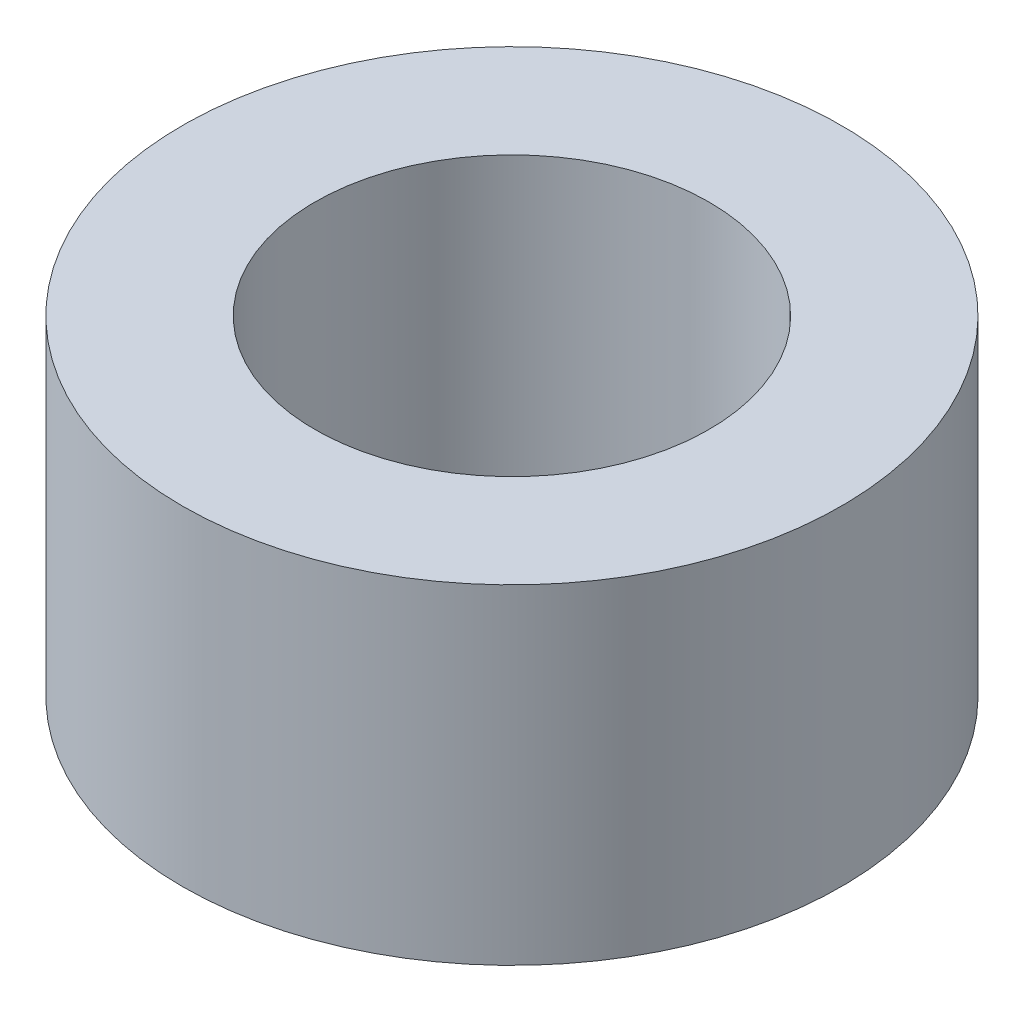
ISO-10303-21;
HEADER;
FILE_DESCRIPTION(('STEP AP214'),'2;1');
FILE_NAME('part.step','',(''),(''),'','','');
FILE_SCHEMA(('AUTOMOTIVE_DESIGN { 1 0 10303 214 1 1 1 1 }'));
ENDSEC;
DATA;
#1=APPLICATION_CONTEXT('core data for automotive mechanical design processes');
#2=APPLICATION_PROTOCOL_DEFINITION('international standard','automotive_design',2000,#1);
#3=PRODUCT_CONTEXT('',#1,'mechanical');
#4=PRODUCT('Part','Part','',(#3));
#5=PRODUCT_RELATED_PRODUCT_CATEGORY('part','',(#4));
#6=PRODUCT_DEFINITION_FORMATION('','',#4);
#7=PRODUCT_DEFINITION_CONTEXT('part definition',#1,'design');
#8=PRODUCT_DEFINITION('design','',#6,#7);
#9=PRODUCT_DEFINITION_SHAPE('','',#8);
#10=(LENGTH_UNIT() NAMED_UNIT(*) SI_UNIT(.MILLI.,.METRE.));
#11=(NAMED_UNIT(*) PLANE_ANGLE_UNIT() SI_UNIT($,.RADIAN.));
#12=(NAMED_UNIT(*) SI_UNIT($,.STERADIAN.) SOLID_ANGLE_UNIT());
#13=UNCERTAINTY_MEASURE_WITH_UNIT(LENGTH_MEASURE(1.E-05),#10,'distance_accuracy_value','');
#14=(GEOMETRIC_REPRESENTATION_CONTEXT(3) GLOBAL_UNCERTAINTY_ASSIGNED_CONTEXT((#13)) GLOBAL_UNIT_ASSIGNED_CONTEXT((#10,
#11,#12)) REPRESENTATION_CONTEXT('',''));
#15=CARTESIAN_POINT('',(0.,0.,0.));
#16=DIRECTION('',(0.,0.,1.));
#17=DIRECTION('',(1.,0.,0.));
#18=AXIS2_PLACEMENT_3D('',#15,#16,#17);
#19=CARTESIAN_POINT('',(0.,3.175,0.));
#20=DIRECTION('',(0.,-1.,0.));
#21=DIRECTION('',(0.,0.,-1.));
#22=AXIS2_PLACEMENT_3D('',#19,#20,#21);
#23=CYLINDRICAL_SURFACE('',#22,3.175);
#24=CARTESIAN_POINT('',(0.,3.175,0.));
#25=DIRECTION('',(0.,1.,0.));
#26=DIRECTION('',(0.,0.,1.));
#27=AXIS2_PLACEMENT_3D('',#24,#25,#26);
#28=CIRCLE('',#27,3.175);
#29=CARTESIAN_POINT('',(0.,3.175,3.175));
#30=VERTEX_POINT('',#29);
#31=EDGE_CURVE('E10',#30,#30,#28,.T.);
#32=ORIENTED_EDGE('',*,*,#31,.F.);
#33=EDGE_LOOP('',(#32));
#34=FACE_BOUND('',#33,.T.);
#35=CARTESIAN_POINT('',(0.,0.,0.));
#36=DIRECTION('',(0.,1.,0.));
#37=DIRECTION('',(0.,0.,1.));
#38=AXIS2_PLACEMENT_3D('',#35,#36,#37);
#39=CIRCLE('',#38,3.175);
#40=CARTESIAN_POINT('',(0.,0.,3.175));
#41=VERTEX_POINT('',#40);
#42=EDGE_CURVE('E34',#41,#41,#39,.T.);
#43=ORIENTED_EDGE('',*,*,#42,.T.);
#44=EDGE_LOOP('',(#43));
#45=FACE_BOUND('',#44,.T.);
#46=ADVANCED_FACE('F31',(#34,#45),#23,.T.);
#47=CARTESIAN_POINT('',(0.,3.175,0.));
#48=DIRECTION('',(0.,1.,0.));
#49=DIRECTION('',(0.,0.,1.));
#50=AXIS2_PLACEMENT_3D('',#47,#48,#49);
#51=PLANE('',#50);
#52=CARTESIAN_POINT('',(0.,3.175,0.));
#53=DIRECTION('',(0.,-1.,0.));
#54=DIRECTION('',(0.,0.,-1.));
#55=AXIS2_PLACEMENT_3D('',#52,#53,#54);
#56=CIRCLE('',#55,1.89865);
#57=CARTESIAN_POINT('',(0.,3.175,-1.89865));
#58=VERTEX_POINT('',#57);
#59=EDGE_CURVE('E41',#58,#58,#56,.T.);
#60=ORIENTED_EDGE('',*,*,#59,.T.);
#61=EDGE_LOOP('',(#60));
#62=FACE_BOUND('',#61,.T.);
#63=ORIENTED_EDGE('',*,*,#31,.T.);
#64=EDGE_LOOP('',(#63));
#65=FACE_BOUND('',#64,.T.);
#66=ADVANCED_FACE('F54',(#62,#65),#51,.T.);
#67=CARTESIAN_POINT('',(0.,0.,0.));
#68=DIRECTION('',(0.,1.,0.));
#69=DIRECTION('',(0.,0.,1.));
#70=AXIS2_PLACEMENT_3D('',#67,#68,#69);
#71=PLANE('',#70);
#72=CARTESIAN_POINT('',(0.,0.,0.));
#73=DIRECTION('',(0.,-1.,0.));
#74=DIRECTION('',(0.,0.,-1.));
#75=AXIS2_PLACEMENT_3D('',#72,#73,#74);
#76=CIRCLE('',#75,1.89865);
#77=CARTESIAN_POINT('',(0.,0.,-1.89865));
#78=VERTEX_POINT('',#77);
#79=EDGE_CURVE('E45',#78,#78,#76,.T.);
#80=ORIENTED_EDGE('',*,*,#79,.F.);
#81=EDGE_LOOP('',(#80));
#82=FACE_BOUND('',#81,.T.);
#83=ORIENTED_EDGE('',*,*,#42,.F.);
#84=EDGE_LOOP('',(#83));
#85=FACE_BOUND('',#84,.T.);
#86=ADVANCED_FACE('F51',(#82,#85),#71,.F.);
#87=CARTESIAN_POINT('',(0.,0.,0.));
#88=DIRECTION('',(0.,-1.,0.));
#89=DIRECTION('',(0.,0.,-1.));
#90=AXIS2_PLACEMENT_3D('',#87,#88,#89);
#91=CYLINDRICAL_SURFACE('',#90,1.89865);
#92=ORIENTED_EDGE('',*,*,#59,.F.);
#93=EDGE_LOOP('',(#92));
#94=FACE_BOUND('',#93,.T.);
#95=ORIENTED_EDGE('',*,*,#79,.T.);
#96=EDGE_LOOP('',(#95));
#97=FACE_BOUND('',#96,.T.);
#98=ADVANCED_FACE('F49',(#94,#97),#91,.F.);
#99=CLOSED_SHELL('',(#46,#66,#86,#98));
#100=MANIFOLD_SOLID_BREP('B2',#99);
#101=ADVANCED_BREP_SHAPE_REPRESENTATION('',(#18,#100),#14);
#102=SHAPE_DEFINITION_REPRESENTATION(#9,#101);
ENDSEC;
END-ISO-10303-21;
